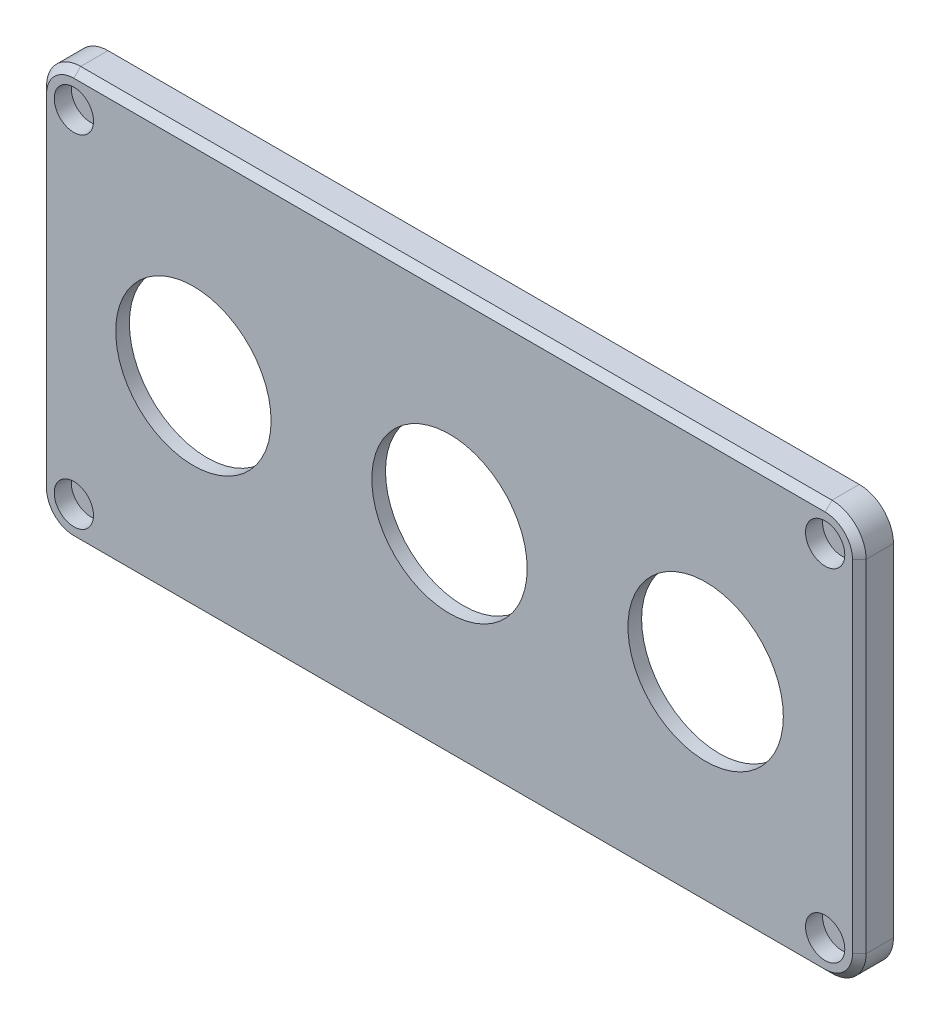
ISO-10303-21;
HEADER;
FILE_DESCRIPTION(('STEP AP214'),'2;1');
FILE_NAME('part.step','',(''),(''),'','','');
FILE_SCHEMA(('AUTOMOTIVE_DESIGN { 1 0 10303 214 1 1 1 1 }'));
ENDSEC;
DATA;
#1=APPLICATION_CONTEXT('core data for automotive mechanical design processes');
#2=APPLICATION_PROTOCOL_DEFINITION('international standard','automotive_design',2000,#1);
#3=PRODUCT_CONTEXT('',#1,'mechanical');
#4=PRODUCT('Part','Part','',(#3));
#5=PRODUCT_RELATED_PRODUCT_CATEGORY('part','',(#4));
#6=PRODUCT_DEFINITION_FORMATION('','',#4);
#7=PRODUCT_DEFINITION_CONTEXT('part definition',#1,'design');
#8=PRODUCT_DEFINITION('design','',#6,#7);
#9=PRODUCT_DEFINITION_SHAPE('','',#8);
#10=(LENGTH_UNIT() NAMED_UNIT(*) SI_UNIT(.MILLI.,.METRE.));
#11=(NAMED_UNIT(*) PLANE_ANGLE_UNIT() SI_UNIT($,.RADIAN.));
#12=(NAMED_UNIT(*) SI_UNIT($,.STERADIAN.) SOLID_ANGLE_UNIT());
#13=UNCERTAINTY_MEASURE_WITH_UNIT(LENGTH_MEASURE(1.E-05),#10,'distance_accuracy_value','');
#14=(GEOMETRIC_REPRESENTATION_CONTEXT(3) GLOBAL_UNCERTAINTY_ASSIGNED_CONTEXT((#13)) GLOBAL_UNIT_ASSIGNED_CONTEXT((#10,
#11,#12)) REPRESENTATION_CONTEXT('',''));
#15=CARTESIAN_POINT('',(0.,0.,0.));
#16=DIRECTION('',(0.,0.,1.));
#17=DIRECTION('',(1.,0.,0.));
#18=AXIS2_PLACEMENT_3D('',#15,#16,#17);
#19=CARTESIAN_POINT('',(-55.,25.,0.));
#20=DIRECTION('',(0.,0.,1.));
#21=DIRECTION('',(1.,0.,0.));
#22=AXIS2_PLACEMENT_3D('',#19,#20,#21);
#23=CYLINDRICAL_SURFACE('',#22,1.5);
#24=CARTESIAN_POINT('',(-55.,25.,0.));
#25=DIRECTION('',(0.,0.,1.));
#26=DIRECTION('',(1.,0.,0.));
#27=AXIS2_PLACEMENT_3D('',#24,#25,#26);
#28=CIRCLE('',#27,1.5);
#29=CARTESIAN_POINT('',(-53.5,25.,0.));
#30=VERTEX_POINT('',#29);
#31=EDGE_CURVE('E457',#30,#30,#28,.T.);
#32=ORIENTED_EDGE('',*,*,#31,.F.);
#33=EDGE_LOOP('',(#32));
#34=FACE_BOUND('',#33,.T.);
#35=CARTESIAN_POINT('',(-55.,25.,2.35));
#36=DIRECTION('',(0.,0.,1.));
#37=DIRECTION('',(1.,0.,0.));
#38=AXIS2_PLACEMENT_3D('',#35,#36,#37);
#39=CIRCLE('',#38,1.5);
#40=CARTESIAN_POINT('',(-53.5,25.,2.35));
#41=VERTEX_POINT('',#40);
#42=EDGE_CURVE('E11',#41,#41,#39,.F.);
#43=ORIENTED_EDGE('',*,*,#42,.F.);
#44=EDGE_LOOP('',(#43));
#45=FACE_BOUND('',#44,.T.);
#46=ADVANCED_FACE('F49',(#34,#45),#23,.F.);
#47=CARTESIAN_POINT('',(55.,25.,0.));
#48=DIRECTION('',(0.,0.,1.));
#49=DIRECTION('',(1.,0.,0.));
#50=AXIS2_PLACEMENT_3D('',#47,#48,#49);
#51=CYLINDRICAL_SURFACE('',#50,1.5);
#52=CARTESIAN_POINT('',(55.,25.,0.));
#53=DIRECTION('',(0.,0.,1.));
#54=DIRECTION('',(1.,0.,0.));
#55=AXIS2_PLACEMENT_3D('',#52,#53,#54);
#56=CIRCLE('',#55,1.5);
#57=CARTESIAN_POINT('',(56.5,25.,0.));
#58=VERTEX_POINT('',#57);
#59=EDGE_CURVE('E464',#58,#58,#56,.T.);
#60=ORIENTED_EDGE('',*,*,#59,.F.);
#61=EDGE_LOOP('',(#60));
#62=FACE_BOUND('',#61,.T.);
#63=CARTESIAN_POINT('',(55.,25.,2.35));
#64=DIRECTION('',(0.,0.,1.));
#65=DIRECTION('',(1.,0.,0.));
#66=AXIS2_PLACEMENT_3D('',#63,#64,#65);
#67=CIRCLE('',#66,1.5);
#68=CARTESIAN_POINT('',(56.5,25.,2.35));
#69=VERTEX_POINT('',#68);
#70=EDGE_CURVE('E59',#69,#69,#67,.F.);
#71=ORIENTED_EDGE('',*,*,#70,.F.);
#72=EDGE_LOOP('',(#71));
#73=FACE_BOUND('',#72,.T.);
#74=ADVANCED_FACE('F309',(#62,#73),#51,.F.);
#75=CARTESIAN_POINT('',(55.,-25.,0.));
#76=DIRECTION('',(0.,0.,1.));
#77=DIRECTION('',(1.,0.,0.));
#78=AXIS2_PLACEMENT_3D('',#75,#76,#77);
#79=CYLINDRICAL_SURFACE('',#78,1.5);
#80=CARTESIAN_POINT('',(55.,-25.,0.));
#81=DIRECTION('',(0.,0.,1.));
#82=DIRECTION('',(1.,0.,0.));
#83=AXIS2_PLACEMENT_3D('',#80,#81,#82);
#84=CIRCLE('',#83,1.5);
#85=CARTESIAN_POINT('',(56.5,-25.,0.));
#86=VERTEX_POINT('',#85);
#87=EDGE_CURVE('E469',#86,#86,#84,.T.);
#88=ORIENTED_EDGE('',*,*,#87,.F.);
#89=EDGE_LOOP('',(#88));
#90=FACE_BOUND('',#89,.T.);
#91=CARTESIAN_POINT('',(55.,-25.,2.35));
#92=DIRECTION('',(0.,0.,1.));
#93=DIRECTION('',(1.,0.,0.));
#94=AXIS2_PLACEMENT_3D('',#91,#92,#93);
#95=CIRCLE('',#94,1.5);
#96=CARTESIAN_POINT('',(56.5,-25.,2.35));
#97=VERTEX_POINT('',#96);
#98=EDGE_CURVE('E300',#97,#97,#95,.F.);
#99=ORIENTED_EDGE('',*,*,#98,.F.);
#100=EDGE_LOOP('',(#99));
#101=FACE_BOUND('',#100,.T.);
#102=ADVANCED_FACE('F311',(#90,#101),#79,.F.);
#103=CARTESIAN_POINT('',(-55.,-25.,0.));
#104=DIRECTION('',(0.,0.,1.));
#105=DIRECTION('',(1.,0.,0.));
#106=AXIS2_PLACEMENT_3D('',#103,#104,#105);
#107=CYLINDRICAL_SURFACE('',#106,1.5);
#108=CARTESIAN_POINT('',(-55.,-25.,0.));
#109=DIRECTION('',(0.,0.,1.));
#110=DIRECTION('',(1.,0.,0.));
#111=AXIS2_PLACEMENT_3D('',#108,#109,#110);
#112=CIRCLE('',#111,1.5);
#113=CARTESIAN_POINT('',(-53.5,-25.,0.));
#114=VERTEX_POINT('',#113);
#115=EDGE_CURVE('E465',#114,#114,#112,.T.);
#116=ORIENTED_EDGE('',*,*,#115,.F.);
#117=EDGE_LOOP('',(#116));
#118=FACE_BOUND('',#117,.T.);
#119=CARTESIAN_POINT('',(-55.,-25.,2.35));
#120=DIRECTION('',(0.,0.,1.));
#121=DIRECTION('',(1.,0.,0.));
#122=AXIS2_PLACEMENT_3D('',#119,#120,#121);
#123=CIRCLE('',#122,1.5);
#124=CARTESIAN_POINT('',(-53.5,-25.,2.35));
#125=VERTEX_POINT('',#124);
#126=EDGE_CURVE('E252',#125,#125,#123,.F.);
#127=ORIENTED_EDGE('',*,*,#126,.F.);
#128=EDGE_LOOP('',(#127));
#129=FACE_BOUND('',#128,.T.);
#130=ADVANCED_FACE('F318',(#118,#129),#107,.F.);
#131=CARTESIAN_POINT('',(0.,0.,0.));
#132=DIRECTION('',(0.,0.,1.));
#133=DIRECTION('',(1.,0.,0.));
#134=AXIS2_PLACEMENT_3D('',#131,#132,#133);
#135=CYLINDRICAL_SURFACE('',#134,11.375);
#136=CARTESIAN_POINT('',(0.,0.,5.));
#137=DIRECTION('',(0.,0.,1.));
#138=DIRECTION('',(1.,0.,0.));
#139=AXIS2_PLACEMENT_3D('',#136,#137,#138);
#140=CIRCLE('',#139,11.375);
#141=CARTESIAN_POINT('',(11.375,0.,5.));
#142=VERTEX_POINT('',#141);
#143=EDGE_CURVE('E444',#142,#142,#140,.T.);
#144=ORIENTED_EDGE('',*,*,#143,.T.);
#145=EDGE_LOOP('',(#144));
#146=FACE_BOUND('',#145,.T.);
#147=CARTESIAN_POINT('',(0.,0.,3.));
#148=DIRECTION('',(0.,0.,-1.));
#149=DIRECTION('',(-1.,0.,0.));
#150=AXIS2_PLACEMENT_3D('',#147,#148,#149);
#151=CIRCLE('',#150,11.375);
#152=CARTESIAN_POINT('',(-11.375,0.,3.));
#153=VERTEX_POINT('',#152);
#154=EDGE_CURVE('E257',#153,#153,#151,.F.);
#155=ORIENTED_EDGE('',*,*,#154,.F.);
#156=EDGE_LOOP('',(#155));
#157=FACE_BOUND('',#156,.T.);
#158=ADVANCED_FACE('F329',(#146,#157),#135,.F.);
#159=CARTESIAN_POINT('',(37.5,0.,0.));
#160=DIRECTION('',(0.,0.,1.));
#161=DIRECTION('',(1.,0.,0.));
#162=AXIS2_PLACEMENT_3D('',#159,#160,#161);
#163=CYLINDRICAL_SURFACE('',#162,11.375);
#164=CARTESIAN_POINT('',(37.5,0.,5.));
#165=DIRECTION('',(0.,0.,1.));
#166=DIRECTION('',(1.,0.,0.));
#167=AXIS2_PLACEMENT_3D('',#164,#165,#166);
#168=CIRCLE('',#167,11.375);
#169=CARTESIAN_POINT('',(48.875,0.,5.));
#170=VERTEX_POINT('',#169);
#171=EDGE_CURVE('E450',#170,#170,#168,.T.);
#172=ORIENTED_EDGE('',*,*,#171,.T.);
#173=EDGE_LOOP('',(#172));
#174=FACE_BOUND('',#173,.T.);
#175=CARTESIAN_POINT('',(37.5,0.,3.));
#176=DIRECTION('',(0.,0.,-1.));
#177=DIRECTION('',(-1.,0.,0.));
#178=AXIS2_PLACEMENT_3D('',#175,#176,#177);
#179=CIRCLE('',#178,11.375);
#180=CARTESIAN_POINT('',(26.125,0.,3.));
#181=VERTEX_POINT('',#180);
#182=EDGE_CURVE('E289',#181,#181,#179,.F.);
#183=ORIENTED_EDGE('',*,*,#182,.F.);
#184=EDGE_LOOP('',(#183));
#185=FACE_BOUND('',#184,.T.);
#186=ADVANCED_FACE('F332',(#174,#185),#163,.F.);
#187=CARTESIAN_POINT('',(-37.5,0.,0.));
#188=DIRECTION('',(0.,0.,1.));
#189=DIRECTION('',(1.,0.,0.));
#190=AXIS2_PLACEMENT_3D('',#187,#188,#189);
#191=CYLINDRICAL_SURFACE('',#190,11.375);
#192=CARTESIAN_POINT('',(-37.5,0.,5.));
#193=DIRECTION('',(0.,0.,1.));
#194=DIRECTION('',(1.,0.,0.));
#195=AXIS2_PLACEMENT_3D('',#192,#193,#194);
#196=CIRCLE('',#195,11.375);
#197=CARTESIAN_POINT('',(-26.125,0.,5.));
#198=VERTEX_POINT('',#197);
#199=EDGE_CURVE('E453',#198,#198,#196,.T.);
#200=ORIENTED_EDGE('',*,*,#199,.T.);
#201=EDGE_LOOP('',(#200));
#202=FACE_BOUND('',#201,.T.);
#203=CARTESIAN_POINT('',(-37.5,0.,3.));
#204=DIRECTION('',(0.,0.,-1.));
#205=DIRECTION('',(-1.,0.,0.));
#206=AXIS2_PLACEMENT_3D('',#203,#204,#205);
#207=CIRCLE('',#206,11.375);
#208=CARTESIAN_POINT('',(-48.875,0.,3.));
#209=VERTEX_POINT('',#208);
#210=EDGE_CURVE('E285',#209,#209,#207,.F.);
#211=ORIENTED_EDGE('',*,*,#210,.F.);
#212=EDGE_LOOP('',(#211));
#213=FACE_BOUND('',#212,.T.);
#214=ADVANCED_FACE('F335',(#202,#213),#191,.F.);
#215=CARTESIAN_POINT('',(60.,30.,5.));
#216=DIRECTION('',(-1.,0.,0.));
#217=DIRECTION('',(0.,-1.,0.));
#218=AXIS2_PLACEMENT_3D('',#215,#216,#217);
#219=PLANE('',#218);
#220=DIRECTION('',(0.,0.,-1.));
#221=VECTOR('',#220,1.);
#222=CARTESIAN_POINT('',(60.,25.,5.));
#223=LINE('',#222,#221);
#224=CARTESIAN_POINT('',(60.,25.,0.));
#225=VERTEX_POINT('',#224);
#226=CARTESIAN_POINT('',(60.,25.,4.));
#227=VERTEX_POINT('',#226);
#228=EDGE_CURVE('E193',#225,#227,#223,.F.);
#229=ORIENTED_EDGE('',*,*,#228,.T.);
#230=DIRECTION('',(0.,-1.,0.));
#231=VECTOR('',#230,1.);
#232=CARTESIAN_POINT('',(60.,-25.,4.));
#233=LINE('',#232,#231);
#234=CARTESIAN_POINT('',(60.,-25.,4.));
#235=VERTEX_POINT('',#234);
#236=EDGE_CURVE('E239',#227,#235,#233,.T.);
#237=ORIENTED_EDGE('',*,*,#236,.T.);
#238=DIRECTION('',(0.,0.,-1.));
#239=VECTOR('',#238,1.);
#240=CARTESIAN_POINT('',(60.,-25.,5.));
#241=LINE('',#240,#239);
#242=CARTESIAN_POINT('',(60.,-25.,0.));
#243=VERTEX_POINT('',#242);
#244=EDGE_CURVE('E197',#235,#243,#241,.T.);
#245=ORIENTED_EDGE('',*,*,#244,.T.);
#246=DIRECTION('',(0.,1.,0.));
#247=VECTOR('',#246,1.);
#248=CARTESIAN_POINT('',(60.,30.,0.));
#249=LINE('',#248,#247);
#250=EDGE_CURVE('E442',#243,#225,#249,.T.);
#251=ORIENTED_EDGE('',*,*,#250,.T.);
#252=EDGE_LOOP('',(#229,#237,#245,#251));
#253=FACE_BOUND('',#252,.T.);
#254=ADVANCED_FACE('F339',(#253),#219,.F.);
#255=CARTESIAN_POINT('',(-60.,30.,5.));
#256=DIRECTION('',(0.,-1.,0.));
#257=DIRECTION('',(0.,0.,-1.));
#258=AXIS2_PLACEMENT_3D('',#255,#256,#257);
#259=PLANE('',#258);
#260=DIRECTION('',(0.,0.,-1.));
#261=VECTOR('',#260,1.);
#262=CARTESIAN_POINT('',(-55.,30.,5.));
#263=LINE('',#262,#261);
#264=CARTESIAN_POINT('',(-55.,30.,0.));
#265=VERTEX_POINT('',#264);
#266=CARTESIAN_POINT('',(-55.,30.,4.));
#267=VERTEX_POINT('',#266);
#268=EDGE_CURVE('E200',#265,#267,#263,.F.);
#269=ORIENTED_EDGE('',*,*,#268,.T.);
#270=DIRECTION('',(1.,0.,0.));
#271=VECTOR('',#270,1.);
#272=CARTESIAN_POINT('',(55.,30.,4.));
#273=LINE('',#272,#271);
#274=CARTESIAN_POINT('',(55.,30.,4.));
#275=VERTEX_POINT('',#274);
#276=EDGE_CURVE('E73',#267,#275,#273,.T.);
#277=ORIENTED_EDGE('',*,*,#276,.T.);
#278=DIRECTION('',(0.,0.,-1.));
#279=VECTOR('',#278,1.);
#280=CARTESIAN_POINT('',(55.,30.,5.));
#281=LINE('',#280,#279);
#282=CARTESIAN_POINT('',(55.,30.,0.));
#283=VERTEX_POINT('',#282);
#284=EDGE_CURVE('E203',#275,#283,#281,.T.);
#285=ORIENTED_EDGE('',*,*,#284,.T.);
#286=DIRECTION('',(-1.,0.,0.));
#287=VECTOR('',#286,1.);
#288=CARTESIAN_POINT('',(-60.,30.,0.));
#289=LINE('',#288,#287);
#290=EDGE_CURVE('E178',#283,#265,#289,.T.);
#291=ORIENTED_EDGE('',*,*,#290,.T.);
#292=EDGE_LOOP('',(#269,#277,#285,#291));
#293=FACE_BOUND('',#292,.T.);
#294=ADVANCED_FACE('F356',(#293),#259,.F.);
#295=CARTESIAN_POINT('',(-60.,30.,5.));
#296=DIRECTION('',(1.,0.,0.));
#297=DIRECTION('',(0.,1.,0.));
#298=AXIS2_PLACEMENT_3D('',#295,#296,#297);
#299=PLANE('',#298);
#300=DIRECTION('',(0.,0.,-1.));
#301=VECTOR('',#300,1.);
#302=CARTESIAN_POINT('',(-60.,-25.,5.));
#303=LINE('',#302,#301);
#304=CARTESIAN_POINT('',(-60.,-25.,0.));
#305=VERTEX_POINT('',#304);
#306=CARTESIAN_POINT('',(-60.,-25.,4.));
#307=VERTEX_POINT('',#306);
#308=EDGE_CURVE('E161',#305,#307,#303,.F.);
#309=ORIENTED_EDGE('',*,*,#308,.T.);
#310=DIRECTION('',(0.,1.,0.));
#311=VECTOR('',#310,1.);
#312=CARTESIAN_POINT('',(-60.,25.,4.));
#313=LINE('',#312,#311);
#314=CARTESIAN_POINT('',(-60.,25.,4.));
#315=VERTEX_POINT('',#314);
#316=EDGE_CURVE('E242',#307,#315,#313,.T.);
#317=ORIENTED_EDGE('',*,*,#316,.T.);
#318=DIRECTION('',(0.,0.,-1.));
#319=VECTOR('',#318,1.);
#320=CARTESIAN_POINT('',(-60.,25.,5.));
#321=LINE('',#320,#319);
#322=CARTESIAN_POINT('',(-60.,25.,0.));
#323=VERTEX_POINT('',#322);
#324=EDGE_CURVE('E166',#315,#323,#321,.T.);
#325=ORIENTED_EDGE('',*,*,#324,.T.);
#326=DIRECTION('',(0.,-1.,0.));
#327=VECTOR('',#326,1.);
#328=CARTESIAN_POINT('',(-60.,30.,0.));
#329=LINE('',#328,#327);
#330=EDGE_CURVE('E173',#323,#305,#329,.T.);
#331=ORIENTED_EDGE('',*,*,#330,.T.);
#332=EDGE_LOOP('',(#309,#317,#325,#331));
#333=FACE_BOUND('',#332,.T.);
#334=ADVANCED_FACE('F353',(#333),#299,.F.);
#335=CARTESIAN_POINT('',(-60.,-30.,5.));
#336=DIRECTION('',(0.,1.,0.));
#337=DIRECTION('',(0.,0.,1.));
#338=AXIS2_PLACEMENT_3D('',#335,#336,#337);
#339=PLANE('',#338);
#340=DIRECTION('',(0.,0.,-1.));
#341=VECTOR('',#340,1.);
#342=CARTESIAN_POINT('',(55.,-30.,5.));
#343=LINE('',#342,#341);
#344=CARTESIAN_POINT('',(55.,-30.,0.));
#345=VERTEX_POINT('',#344);
#346=CARTESIAN_POINT('',(55.,-30.,4.));
#347=VERTEX_POINT('',#346);
#348=EDGE_CURVE('E155',#345,#347,#343,.F.);
#349=ORIENTED_EDGE('',*,*,#348,.T.);
#350=DIRECTION('',(-1.,0.,0.));
#351=VECTOR('',#350,1.);
#352=CARTESIAN_POINT('',(-55.,-30.,4.));
#353=LINE('',#352,#351);
#354=CARTESIAN_POINT('',(-55.,-30.,4.));
#355=VERTEX_POINT('',#354);
#356=EDGE_CURVE('E151',#347,#355,#353,.T.);
#357=ORIENTED_EDGE('',*,*,#356,.T.);
#358=DIRECTION('',(0.,0.,-1.));
#359=VECTOR('',#358,1.);
#360=CARTESIAN_POINT('',(-55.,-30.,5.));
#361=LINE('',#360,#359);
#362=CARTESIAN_POINT('',(-55.,-30.,0.));
#363=VERTEX_POINT('',#362);
#364=EDGE_CURVE('E143',#355,#363,#361,.T.);
#365=ORIENTED_EDGE('',*,*,#364,.T.);
#366=DIRECTION('',(1.,0.,0.));
#367=VECTOR('',#366,1.);
#368=CARTESIAN_POINT('',(-60.,-30.,0.));
#369=LINE('',#368,#367);
#370=EDGE_CURVE('E148',#363,#345,#369,.T.);
#371=ORIENTED_EDGE('',*,*,#370,.T.);
#372=EDGE_LOOP('',(#349,#357,#365,#371));
#373=FACE_BOUND('',#372,.T.);
#374=ADVANCED_FACE('F146',(#373),#339,.F.);
#375=CARTESIAN_POINT('',(0.,0.,5.));
#376=DIRECTION('',(0.,0.,1.));
#377=DIRECTION('',(1.,0.,0.));
#378=AXIS2_PLACEMENT_3D('',#375,#376,#377);
#379=PLANE('',#378);
#380=CARTESIAN_POINT('',(-55.,-25.,5.));
#381=DIRECTION('',(0.,0.,1.));
#382=DIRECTION('',(1.,0.,0.));
#383=AXIS2_PLACEMENT_3D('',#380,#381,#382);
#384=CIRCLE('',#383,4.00000000000001);
#385=CARTESIAN_POINT('',(-59.,-25.,5.));
#386=VERTEX_POINT('',#385);
#387=CARTESIAN_POINT('',(-55.,-29.,5.));
#388=VERTEX_POINT('',#387);
#389=EDGE_CURVE('E221',#386,#388,#384,.T.);
#390=ORIENTED_EDGE('',*,*,#389,.T.);
#391=DIRECTION('',(1.,0.,0.));
#392=VECTOR('',#391,1.);
#393=CARTESIAN_POINT('',(55.,-29.,5.));
#394=LINE('',#393,#392);
#395=CARTESIAN_POINT('',(55.,-29.,5.));
#396=VERTEX_POINT('',#395);
#397=EDGE_CURVE('E227',#388,#396,#394,.T.);
#398=ORIENTED_EDGE('',*,*,#397,.T.);
#399=CARTESIAN_POINT('',(55.,-25.,5.));
#400=DIRECTION('',(0.,0.,1.));
#401=DIRECTION('',(1.,0.,0.));
#402=AXIS2_PLACEMENT_3D('',#399,#400,#401);
#403=CIRCLE('',#402,4.00000000000001);
#404=CARTESIAN_POINT('',(59.,-25.,5.));
#405=VERTEX_POINT('',#404);
#406=EDGE_CURVE('E224',#396,#405,#403,.T.);
#407=ORIENTED_EDGE('',*,*,#406,.T.);
#408=DIRECTION('',(0.,1.,0.));
#409=VECTOR('',#408,1.);
#410=CARTESIAN_POINT('',(59.,25.,5.));
#411=LINE('',#410,#409);
#412=CARTESIAN_POINT('',(59.,25.,5.));
#413=VERTEX_POINT('',#412);
#414=EDGE_CURVE('E218',#405,#413,#411,.T.);
#415=ORIENTED_EDGE('',*,*,#414,.T.);
#416=CARTESIAN_POINT('',(55.,25.,5.));
#417=DIRECTION('',(0.,0.,1.));
#418=DIRECTION('',(1.,0.,0.));
#419=AXIS2_PLACEMENT_3D('',#416,#417,#418);
#420=CIRCLE('',#419,4.00000000000001);
#421=CARTESIAN_POINT('',(55.,29.,5.));
#422=VERTEX_POINT('',#421);
#423=EDGE_CURVE('E212',#413,#422,#420,.T.);
#424=ORIENTED_EDGE('',*,*,#423,.T.);
#425=DIRECTION('',(-1.,0.,0.));
#426=VECTOR('',#425,1.);
#427=CARTESIAN_POINT('',(-55.,29.,5.));
#428=LINE('',#427,#426);
#429=CARTESIAN_POINT('',(-55.,29.,5.));
#430=VERTEX_POINT('',#429);
#431=EDGE_CURVE('E206',#422,#430,#428,.T.);
#432=ORIENTED_EDGE('',*,*,#431,.T.);
#433=CARTESIAN_POINT('',(-55.,25.,5.));
#434=DIRECTION('',(0.,0.,1.));
#435=DIRECTION('',(1.,0.,0.));
#436=AXIS2_PLACEMENT_3D('',#433,#434,#435);
#437=CIRCLE('',#436,4.00000000000001);
#438=CARTESIAN_POINT('',(-59.,25.,5.));
#439=VERTEX_POINT('',#438);
#440=EDGE_CURVE('E209',#430,#439,#437,.T.);
#441=ORIENTED_EDGE('',*,*,#440,.T.);
#442=DIRECTION('',(0.,-1.,0.));
#443=VECTOR('',#442,1.);
#444=CARTESIAN_POINT('',(-59.,-25.,5.));
#445=LINE('',#444,#443);
#446=EDGE_CURVE('E215',#439,#386,#445,.T.);
#447=ORIENTED_EDGE('',*,*,#446,.T.);
#448=EDGE_LOOP('',(#390,#398,#407,#415,#424,#432,#441,#447));
#449=FACE_BOUND('',#448,.T.);
#450=CARTESIAN_POINT('',(-55.,-25.,5.));
#451=DIRECTION('',(0.,0.,1.));
#452=DIRECTION('',(1.,0.,0.));
#453=AXIS2_PLACEMENT_3D('',#450,#451,#452);
#454=CIRCLE('',#453,2.875);
#455=CARTESIAN_POINT('',(-52.125,-25.,5.));
#456=VERTEX_POINT('',#455);
#457=EDGE_CURVE('E488',#456,#456,#454,.T.);
#458=ORIENTED_EDGE('',*,*,#457,.F.);
#459=EDGE_LOOP('',(#458));
#460=FACE_BOUND('',#459,.T.);
#461=CARTESIAN_POINT('',(55.,-25.,5.));
#462=DIRECTION('',(0.,0.,1.));
#463=DIRECTION('',(1.,0.,0.));
#464=AXIS2_PLACEMENT_3D('',#461,#462,#463);
#465=CIRCLE('',#464,2.875);
#466=CARTESIAN_POINT('',(57.875,-25.,5.));
#467=VERTEX_POINT('',#466);
#468=EDGE_CURVE('E496',#467,#467,#465,.T.);
#469=ORIENTED_EDGE('',*,*,#468,.F.);
#470=EDGE_LOOP('',(#469));
#471=FACE_BOUND('',#470,.T.);
#472=CARTESIAN_POINT('',(55.,25.,5.));
#473=DIRECTION('',(0.,0.,1.));
#474=DIRECTION('',(1.,0.,0.));
#475=AXIS2_PLACEMENT_3D('',#472,#473,#474);
#476=CIRCLE('',#475,2.875);
#477=CARTESIAN_POINT('',(57.875,25.,5.));
#478=VERTEX_POINT('',#477);
#479=EDGE_CURVE('E481',#478,#478,#476,.T.);
#480=ORIENTED_EDGE('',*,*,#479,.F.);
#481=EDGE_LOOP('',(#480));
#482=FACE_BOUND('',#481,.T.);
#483=CARTESIAN_POINT('',(-55.,25.,5.));
#484=DIRECTION('',(0.,0.,1.));
#485=DIRECTION('',(1.,0.,0.));
#486=AXIS2_PLACEMENT_3D('',#483,#484,#485);
#487=CIRCLE('',#486,2.875);
#488=CARTESIAN_POINT('',(-52.125,25.,5.));
#489=VERTEX_POINT('',#488);
#490=EDGE_CURVE('E477',#489,#489,#487,.T.);
#491=ORIENTED_EDGE('',*,*,#490,.F.);
#492=EDGE_LOOP('',(#491));
#493=FACE_BOUND('',#492,.T.);
#494=ORIENTED_EDGE('',*,*,#199,.F.);
#495=EDGE_LOOP('',(#494));
#496=FACE_BOUND('',#495,.T.);
#497=ORIENTED_EDGE('',*,*,#171,.F.);
#498=EDGE_LOOP('',(#497));
#499=FACE_BOUND('',#498,.T.);
#500=ORIENTED_EDGE('',*,*,#143,.F.);
#501=EDGE_LOOP('',(#500));
#502=FACE_BOUND('',#501,.T.);
#503=ADVANCED_FACE('F344',(#449,#460,#471,#482,#493,#496,#499,#502),#379,.T.);
#504=CARTESIAN_POINT('',(0.,0.,0.));
#505=DIRECTION('',(0.,0.,1.));
#506=DIRECTION('',(1.,0.,0.));
#507=AXIS2_PLACEMENT_3D('',#504,#505,#506);
#508=PLANE('',#507);
#509=CARTESIAN_POINT('',(37.5,0.,0.));
#510=DIRECTION('',(0.,0.,-1.));
#511=DIRECTION('',(-1.,0.,0.));
#512=AXIS2_PLACEMENT_3D('',#509,#510,#511);
#513=CIRCLE('',#512,16.);
#514=CARTESIAN_POINT('',(21.5,0.,0.));
#515=VERTEX_POINT('',#514);
#516=EDGE_CURVE('E523',#515,#515,#513,.T.);
#517=ORIENTED_EDGE('',*,*,#516,.F.);
#518=EDGE_LOOP('',(#517));
#519=FACE_BOUND('',#518,.T.);
#520=CARTESIAN_POINT('',(0.,0.,0.));
#521=DIRECTION('',(0.,0.,-1.));
#522=DIRECTION('',(-1.,0.,0.));
#523=AXIS2_PLACEMENT_3D('',#520,#521,#522);
#524=CIRCLE('',#523,16.);
#525=CARTESIAN_POINT('',(-16.,0.,0.));
#526=VERTEX_POINT('',#525);
#527=EDGE_CURVE('E519',#526,#526,#524,.T.);
#528=ORIENTED_EDGE('',*,*,#527,.F.);
#529=EDGE_LOOP('',(#528));
#530=FACE_BOUND('',#529,.T.);
#531=CARTESIAN_POINT('',(-37.5,0.,0.));
#532=DIRECTION('',(0.,0.,-1.));
#533=DIRECTION('',(-1.,0.,0.));
#534=AXIS2_PLACEMENT_3D('',#531,#532,#533);
#535=CIRCLE('',#534,16.);
#536=CARTESIAN_POINT('',(-53.5,0.,0.));
#537=VERTEX_POINT('',#536);
#538=EDGE_CURVE('E511',#537,#537,#535,.T.);
#539=ORIENTED_EDGE('',*,*,#538,.F.);
#540=EDGE_LOOP('',(#539));
#541=FACE_BOUND('',#540,.T.);
#542=ORIENTED_EDGE('',*,*,#115,.T.);
#543=EDGE_LOOP('',(#542));
#544=FACE_BOUND('',#543,.T.);
#545=ORIENTED_EDGE('',*,*,#87,.T.);
#546=EDGE_LOOP('',(#545));
#547=FACE_BOUND('',#546,.T.);
#548=ORIENTED_EDGE('',*,*,#59,.T.);
#549=EDGE_LOOP('',(#548));
#550=FACE_BOUND('',#549,.T.);
#551=ORIENTED_EDGE('',*,*,#31,.T.);
#552=EDGE_LOOP('',(#551));
#553=FACE_BOUND('',#552,.T.);
#554=ORIENTED_EDGE('',*,*,#370,.F.);
#555=CARTESIAN_POINT('',(-55.,-25.,0.));
#556=DIRECTION('',(0.,0.,1.));
#557=DIRECTION('',(1.,0.,0.));
#558=AXIS2_PLACEMENT_3D('',#555,#556,#557);
#559=CIRCLE('',#558,5.);
#560=EDGE_CURVE('E158',#363,#305,#559,.F.);
#561=ORIENTED_EDGE('',*,*,#560,.T.);
#562=ORIENTED_EDGE('',*,*,#330,.F.);
#563=CARTESIAN_POINT('',(-55.,25.,0.));
#564=DIRECTION('',(0.,0.,1.));
#565=DIRECTION('',(1.,0.,0.));
#566=AXIS2_PLACEMENT_3D('',#563,#564,#565);
#567=CIRCLE('',#566,5.);
#568=EDGE_CURVE('E154',#323,#265,#567,.F.);
#569=ORIENTED_EDGE('',*,*,#568,.T.);
#570=ORIENTED_EDGE('',*,*,#290,.F.);
#571=CARTESIAN_POINT('',(55.,25.,0.));
#572=DIRECTION('',(0.,0.,1.));
#573=DIRECTION('',(1.,0.,0.));
#574=AXIS2_PLACEMENT_3D('',#571,#572,#573);
#575=CIRCLE('',#574,5.);
#576=EDGE_CURVE('E184',#283,#225,#575,.F.);
#577=ORIENTED_EDGE('',*,*,#576,.T.);
#578=ORIENTED_EDGE('',*,*,#250,.F.);
#579=CARTESIAN_POINT('',(55.,-25.,0.));
#580=DIRECTION('',(0.,0.,1.));
#581=DIRECTION('',(1.,0.,0.));
#582=AXIS2_PLACEMENT_3D('',#579,#580,#581);
#583=CIRCLE('',#582,5.);
#584=EDGE_CURVE('E167',#243,#345,#583,.F.);
#585=ORIENTED_EDGE('',*,*,#584,.T.);
#586=EDGE_LOOP('',(#554,#561,#562,#569,#570,#577,#578,#585));
#587=FACE_BOUND('',#586,.T.);
#588=ADVANCED_FACE('F169',(#519,#530,#541,#544,#547,#550,#553,#587),#508,.F.);
#589=CARTESIAN_POINT('',(-55.,-25.,5.));
#590=DIRECTION('',(0.,0.,-1.));
#591=DIRECTION('',(-1.,0.,0.));
#592=AXIS2_PLACEMENT_3D('',#589,#590,#591);
#593=CYLINDRICAL_SURFACE('',#592,5.);
#594=ORIENTED_EDGE('',*,*,#364,.F.);
#595=CARTESIAN_POINT('',(-55.,-25.,4.));
#596=DIRECTION('',(0.,0.,1.));
#597=DIRECTION('',(1.,0.,0.));
#598=AXIS2_PLACEMENT_3D('',#595,#596,#597);
#599=CIRCLE('',#598,5.);
#600=EDGE_CURVE('E236',#355,#307,#599,.F.);
#601=ORIENTED_EDGE('',*,*,#600,.T.);
#602=ORIENTED_EDGE('',*,*,#308,.F.);
#603=ORIENTED_EDGE('',*,*,#560,.F.);
#604=EDGE_LOOP('',(#594,#601,#602,#603));
#605=FACE_BOUND('',#604,.T.);
#606=ADVANCED_FACE('F159',(#605),#593,.T.);
#607=CARTESIAN_POINT('',(55.,-25.,5.));
#608=DIRECTION('',(0.,0.,-1.));
#609=DIRECTION('',(-1.,0.,0.));
#610=AXIS2_PLACEMENT_3D('',#607,#608,#609);
#611=CYLINDRICAL_SURFACE('',#610,5.);
#612=ORIENTED_EDGE('',*,*,#244,.F.);
#613=CARTESIAN_POINT('',(55.,-25.,4.));
#614=DIRECTION('',(0.,0.,1.));
#615=DIRECTION('',(1.,0.,0.));
#616=AXIS2_PLACEMENT_3D('',#613,#614,#615);
#617=CIRCLE('',#616,5.);
#618=EDGE_CURVE('E233',#235,#347,#617,.F.);
#619=ORIENTED_EDGE('',*,*,#618,.T.);
#620=ORIENTED_EDGE('',*,*,#348,.F.);
#621=ORIENTED_EDGE('',*,*,#584,.F.);
#622=EDGE_LOOP('',(#612,#619,#620,#621));
#623=FACE_BOUND('',#622,.T.);
#624=ADVANCED_FACE('F365',(#623),#611,.T.);
#625=CARTESIAN_POINT('',(55.,25.,5.));
#626=DIRECTION('',(0.,0.,-1.));
#627=DIRECTION('',(-1.,0.,0.));
#628=AXIS2_PLACEMENT_3D('',#625,#626,#627);
#629=CYLINDRICAL_SURFACE('',#628,5.);
#630=ORIENTED_EDGE('',*,*,#284,.F.);
#631=CARTESIAN_POINT('',(55.,25.,4.));
#632=DIRECTION('',(0.,0.,1.));
#633=DIRECTION('',(1.,0.,0.));
#634=AXIS2_PLACEMENT_3D('',#631,#632,#633);
#635=CIRCLE('',#634,5.);
#636=EDGE_CURVE('E245',#275,#227,#635,.F.);
#637=ORIENTED_EDGE('',*,*,#636,.T.);
#638=ORIENTED_EDGE('',*,*,#228,.F.);
#639=ORIENTED_EDGE('',*,*,#576,.F.);
#640=EDGE_LOOP('',(#630,#637,#638,#639));
#641=FACE_BOUND('',#640,.T.);
#642=ADVANCED_FACE('F368',(#641),#629,.T.);
#643=CARTESIAN_POINT('',(-55.,25.,5.));
#644=DIRECTION('',(0.,0.,-1.));
#645=DIRECTION('',(-1.,0.,0.));
#646=AXIS2_PLACEMENT_3D('',#643,#644,#645);
#647=CYLINDRICAL_SURFACE('',#646,5.);
#648=ORIENTED_EDGE('',*,*,#324,.F.);
#649=CARTESIAN_POINT('',(-55.,25.,4.));
#650=DIRECTION('',(0.,0.,1.));
#651=DIRECTION('',(1.,0.,0.));
#652=AXIS2_PLACEMENT_3D('',#649,#650,#651);
#653=CIRCLE('',#652,5.);
#654=EDGE_CURVE('E66',#315,#267,#653,.F.);
#655=ORIENTED_EDGE('',*,*,#654,.T.);
#656=ORIENTED_EDGE('',*,*,#268,.F.);
#657=ORIENTED_EDGE('',*,*,#568,.F.);
#658=EDGE_LOOP('',(#648,#655,#656,#657));
#659=FACE_BOUND('',#658,.T.);
#660=ADVANCED_FACE('F372',(#659),#647,.T.);
#661=CARTESIAN_POINT('',(-55.,-25.,2.5));
#662=DIRECTION('',(0.,0.,1.));
#663=DIRECTION('',(1.,0.,0.));
#664=AXIS2_PLACEMENT_3D('',#661,#662,#663);
#665=PLANE('',#664);
#666=CARTESIAN_POINT('',(-55.,-25.,2.5));
#667=DIRECTION('',(0.,0.,1.));
#668=DIRECTION('',(1.,0.,0.));
#669=AXIS2_PLACEMENT_3D('',#666,#667,#668);
#670=CIRCLE('',#669,2.875);
#671=CARTESIAN_POINT('',(-52.125,-25.,2.5));
#672=VERTEX_POINT('',#671);
#673=EDGE_CURVE('E284',#672,#672,#670,.T.);
#674=ORIENTED_EDGE('',*,*,#673,.T.);
#675=EDGE_LOOP('',(#674));
#676=FACE_BOUND('',#675,.T.);
#677=ADVANCED_FACE('F376',(#676),#665,.T.);
#678=CARTESIAN_POINT('',(-55.,-25.,2.5));
#679=DIRECTION('',(0.,0.,1.));
#680=DIRECTION('',(1.,0.,0.));
#681=AXIS2_PLACEMENT_3D('',#678,#679,#680);
#682=CYLINDRICAL_SURFACE('',#681,2.875);
#683=ORIENTED_EDGE('',*,*,#673,.F.);
#684=EDGE_LOOP('',(#683));
#685=FACE_BOUND('',#684,.T.);
#686=ORIENTED_EDGE('',*,*,#457,.T.);
#687=EDGE_LOOP('',(#686));
#688=FACE_BOUND('',#687,.T.);
#689=ADVANCED_FACE('F598',(#685,#688),#682,.F.);
#690=CARTESIAN_POINT('',(55.,-25.,2.5));
#691=DIRECTION('',(0.,0.,1.));
#692=DIRECTION('',(1.,0.,0.));
#693=AXIS2_PLACEMENT_3D('',#690,#691,#692);
#694=PLANE('',#693);
#695=CARTESIAN_POINT('',(55.,-25.,2.5));
#696=DIRECTION('',(0.,0.,1.));
#697=DIRECTION('',(1.,0.,0.));
#698=AXIS2_PLACEMENT_3D('',#695,#696,#697);
#699=CIRCLE('',#698,2.875);
#700=CARTESIAN_POINT('',(57.875,-25.,2.5));
#701=VERTEX_POINT('',#700);
#702=EDGE_CURVE('E492',#701,#701,#699,.T.);
#703=ORIENTED_EDGE('',*,*,#702,.T.);
#704=EDGE_LOOP('',(#703));
#705=FACE_BOUND('',#704,.T.);
#706=ADVANCED_FACE('F594',(#705),#694,.T.);
#707=CARTESIAN_POINT('',(55.,-25.,2.5));
#708=DIRECTION('',(0.,0.,1.));
#709=DIRECTION('',(1.,0.,0.));
#710=AXIS2_PLACEMENT_3D('',#707,#708,#709);
#711=CYLINDRICAL_SURFACE('',#710,2.875);
#712=ORIENTED_EDGE('',*,*,#702,.F.);
#713=EDGE_LOOP('',(#712));
#714=FACE_BOUND('',#713,.T.);
#715=ORIENTED_EDGE('',*,*,#468,.T.);
#716=EDGE_LOOP('',(#715));
#717=FACE_BOUND('',#716,.T.);
#718=ADVANCED_FACE('F590',(#714,#717),#711,.F.);
#719=CARTESIAN_POINT('',(55.,25.,2.5));
#720=DIRECTION('',(0.,0.,1.));
#721=DIRECTION('',(1.,0.,0.));
#722=AXIS2_PLACEMENT_3D('',#719,#720,#721);
#723=PLANE('',#722);
#724=CARTESIAN_POINT('',(55.,25.,2.5));
#725=DIRECTION('',(0.,0.,1.));
#726=DIRECTION('',(1.,0.,0.));
#727=AXIS2_PLACEMENT_3D('',#724,#725,#726);
#728=CIRCLE('',#727,2.875);
#729=CARTESIAN_POINT('',(57.875,25.,2.5));
#730=VERTEX_POINT('',#729);
#731=EDGE_CURVE('E500',#730,#730,#728,.T.);
#732=ORIENTED_EDGE('',*,*,#731,.T.);
#733=EDGE_LOOP('',(#732));
#734=FACE_BOUND('',#733,.T.);
#735=ADVANCED_FACE('F586',(#734),#723,.T.);
#736=CARTESIAN_POINT('',(55.,25.,2.5));
#737=DIRECTION('',(0.,0.,1.));
#738=DIRECTION('',(1.,0.,0.));
#739=AXIS2_PLACEMENT_3D('',#736,#737,#738);
#740=CYLINDRICAL_SURFACE('',#739,2.875);
#741=ORIENTED_EDGE('',*,*,#731,.F.);
#742=EDGE_LOOP('',(#741));
#743=FACE_BOUND('',#742,.T.);
#744=ORIENTED_EDGE('',*,*,#479,.T.);
#745=EDGE_LOOP('',(#744));
#746=FACE_BOUND('',#745,.T.);
#747=ADVANCED_FACE('F582',(#743,#746),#740,.F.);
#748=CARTESIAN_POINT('',(-55.,25.,2.5));
#749=DIRECTION('',(0.,0.,1.));
#750=DIRECTION('',(1.,0.,0.));
#751=AXIS2_PLACEMENT_3D('',#748,#749,#750);
#752=PLANE('',#751);
#753=CARTESIAN_POINT('',(-55.,25.,2.5));
#754=DIRECTION('',(0.,0.,1.));
#755=DIRECTION('',(1.,0.,0.));
#756=AXIS2_PLACEMENT_3D('',#753,#754,#755);
#757=CIRCLE('',#756,2.875);
#758=CARTESIAN_POINT('',(-52.125,25.,2.5));
#759=VERTEX_POINT('',#758);
#760=EDGE_CURVE('E470',#759,#759,#757,.T.);
#761=ORIENTED_EDGE('',*,*,#760,.T.);
#762=EDGE_LOOP('',(#761));
#763=FACE_BOUND('',#762,.T.);
#764=ADVANCED_FACE('F585',(#763),#752,.T.);
#765=CARTESIAN_POINT('',(-55.,25.,2.5));
#766=DIRECTION('',(0.,0.,1.));
#767=DIRECTION('',(1.,0.,0.));
#768=AXIS2_PLACEMENT_3D('',#765,#766,#767);
#769=CYLINDRICAL_SURFACE('',#768,2.875);
#770=ORIENTED_EDGE('',*,*,#760,.F.);
#771=EDGE_LOOP('',(#770));
#772=FACE_BOUND('',#771,.T.);
#773=ORIENTED_EDGE('',*,*,#490,.T.);
#774=EDGE_LOOP('',(#773));
#775=FACE_BOUND('',#774,.T.);
#776=ADVANCED_FACE('F325',(#772,#775),#769,.F.);
#777=CARTESIAN_POINT('',(0.,29.,5.));
#778=DIRECTION('',(0.,0.707106781186552,0.707106781186543));
#779=DIRECTION('',(1.,0.,0.));
#780=AXIS2_PLACEMENT_3D('',#777,#778,#779);
#781=PLANE('',#780);
#782=DIRECTION('',(0.,-0.707106781186543,0.707106781186552));
#783=VECTOR('',#782,1.);
#784=CARTESIAN_POINT('',(55.,30.,4.));
#785=LINE('',#784,#783);
#786=EDGE_CURVE('E276',#275,#422,#785,.T.);
#787=ORIENTED_EDGE('',*,*,#786,.F.);
#788=ORIENTED_EDGE('',*,*,#276,.F.);
#789=DIRECTION('',(0.,0.707106781186543,-0.707106781186552));
#790=VECTOR('',#789,1.);
#791=CARTESIAN_POINT('',(-55.,29.,5.));
#792=LINE('',#791,#790);
#793=EDGE_CURVE('E280',#430,#267,#792,.T.);
#794=ORIENTED_EDGE('',*,*,#793,.F.);
#795=ORIENTED_EDGE('',*,*,#431,.F.);
#796=EDGE_LOOP('',(#787,#788,#794,#795));
#797=FACE_BOUND('',#796,.T.);
#798=ADVANCED_FACE('F52',(#797),#781,.T.);
#799=CARTESIAN_POINT('',(-55.,25.,5.));
#800=DIRECTION('',(0.,0.,-1.));
#801=DIRECTION('',(-1.,0.,0.));
#802=AXIS2_PLACEMENT_3D('',#799,#800,#801);
#803=CONICAL_SURFACE('',#802,4.00000000000001,0.785398163397441);
#804=ORIENTED_EDGE('',*,*,#793,.T.);
#805=ORIENTED_EDGE('',*,*,#654,.F.);
#806=DIRECTION('',(-0.707106781186543,0.,-0.707106781186552));
#807=VECTOR('',#806,1.);
#808=CARTESIAN_POINT('',(-59.,25.,5.));
#809=LINE('',#808,#807);
#810=EDGE_CURVE('E272',#439,#315,#809,.T.);
#811=ORIENTED_EDGE('',*,*,#810,.F.);
#812=ORIENTED_EDGE('',*,*,#440,.F.);
#813=EDGE_LOOP('',(#804,#805,#811,#812));
#814=FACE_BOUND('',#813,.T.);
#815=ADVANCED_FACE('F419',(#814),#803,.T.);
#816=CARTESIAN_POINT('',(55.,25.,5.));
#817=DIRECTION('',(0.,0.,-1.));
#818=DIRECTION('',(-1.,0.,0.));
#819=AXIS2_PLACEMENT_3D('',#816,#817,#818);
#820=CONICAL_SURFACE('',#819,4.00000000000001,0.785398163397443);
#821=ORIENTED_EDGE('',*,*,#786,.T.);
#822=ORIENTED_EDGE('',*,*,#423,.F.);
#823=DIRECTION('',(-0.707106781186543,0.,0.707106781186552));
#824=VECTOR('',#823,1.);
#825=CARTESIAN_POINT('',(60.,25.,4.));
#826=LINE('',#825,#824);
#827=EDGE_CURVE('E268',#227,#413,#826,.T.);
#828=ORIENTED_EDGE('',*,*,#827,.F.);
#829=ORIENTED_EDGE('',*,*,#636,.F.);
#830=EDGE_LOOP('',(#821,#822,#828,#829));
#831=FACE_BOUND('',#830,.T.);
#832=ADVANCED_FACE('F413',(#831),#820,.T.);
#833=CARTESIAN_POINT('',(-59.,0.,5.));
#834=DIRECTION('',(-0.707106781186554,0.,0.707106781186541));
#835=DIRECTION('',(0.,1.,0.));
#836=AXIS2_PLACEMENT_3D('',#833,#834,#835);
#837=PLANE('',#836);
#838=ORIENTED_EDGE('',*,*,#810,.T.);
#839=ORIENTED_EDGE('',*,*,#316,.F.);
#840=DIRECTION('',(-0.70710678118654,0.,-0.707106781186555));
#841=VECTOR('',#840,1.);
#842=CARTESIAN_POINT('',(-59.,-25.,5.));
#843=LINE('',#842,#841);
#844=EDGE_CURVE('E264',#386,#307,#843,.T.);
#845=ORIENTED_EDGE('',*,*,#844,.F.);
#846=ORIENTED_EDGE('',*,*,#446,.F.);
#847=EDGE_LOOP('',(#838,#839,#845,#846));
#848=FACE_BOUND('',#847,.T.);
#849=ADVANCED_FACE('F406',(#848),#837,.T.);
#850=CARTESIAN_POINT('',(59.,0.,5.));
#851=DIRECTION('',(0.707106781186551,0.,0.707106781186544));
#852=DIRECTION('',(0.,-1.,0.));
#853=AXIS2_PLACEMENT_3D('',#850,#851,#852);
#854=PLANE('',#853);
#855=ORIENTED_EDGE('',*,*,#827,.T.);
#856=ORIENTED_EDGE('',*,*,#414,.F.);
#857=DIRECTION('',(-0.707106781186543,0.,0.707106781186552));
#858=VECTOR('',#857,1.);
#859=CARTESIAN_POINT('',(60.,-25.,4.));
#860=LINE('',#859,#858);
#861=EDGE_CURVE('E260',#235,#405,#860,.T.);
#862=ORIENTED_EDGE('',*,*,#861,.F.);
#863=ORIENTED_EDGE('',*,*,#236,.F.);
#864=EDGE_LOOP('',(#855,#856,#862,#863));
#865=FACE_BOUND('',#864,.T.);
#866=ADVANCED_FACE('F399',(#865),#854,.T.);
#867=CARTESIAN_POINT('',(-55.,-25.,5.));
#868=DIRECTION('',(0.,0.,-1.));
#869=DIRECTION('',(-1.,0.,0.));
#870=AXIS2_PLACEMENT_3D('',#867,#868,#869);
#871=CONICAL_SURFACE('',#870,4.00000000000001,0.785398163397443);
#872=ORIENTED_EDGE('',*,*,#844,.T.);
#873=ORIENTED_EDGE('',*,*,#600,.F.);
#874=DIRECTION('',(0.,-0.707106781186544,-0.707106781186551));
#875=VECTOR('',#874,1.);
#876=CARTESIAN_POINT('',(-55.,-29.,5.));
#877=LINE('',#876,#875);
#878=EDGE_CURVE('E256',#388,#355,#877,.T.);
#879=ORIENTED_EDGE('',*,*,#878,.F.);
#880=ORIENTED_EDGE('',*,*,#389,.F.);
#881=EDGE_LOOP('',(#872,#873,#879,#880));
#882=FACE_BOUND('',#881,.T.);
#883=ADVANCED_FACE('F392',(#882),#871,.T.);
#884=CARTESIAN_POINT('',(55.,-25.,5.));
#885=DIRECTION('',(0.,0.,-1.));
#886=DIRECTION('',(-1.,0.,0.));
#887=AXIS2_PLACEMENT_3D('',#884,#885,#886);
#888=CONICAL_SURFACE('',#887,4.00000000000001,0.785398163397441);
#889=ORIENTED_EDGE('',*,*,#861,.T.);
#890=ORIENTED_EDGE('',*,*,#406,.F.);
#891=DIRECTION('',(0.,0.707106781186544,0.707106781186551));
#892=VECTOR('',#891,1.);
#893=CARTESIAN_POINT('',(55.,-30.,4.));
#894=LINE('',#893,#892);
#895=EDGE_CURVE('E253',#347,#396,#894,.T.);
#896=ORIENTED_EDGE('',*,*,#895,.F.);
#897=ORIENTED_EDGE('',*,*,#618,.F.);
#898=EDGE_LOOP('',(#889,#890,#896,#897));
#899=FACE_BOUND('',#898,.T.);
#900=ADVANCED_FACE('F385',(#899),#888,.T.);
#901=CARTESIAN_POINT('',(0.,-29.,5.));
#902=DIRECTION('',(0.,-0.707106781186552,0.707106781186543));
#903=DIRECTION('',(-1.,0.,0.));
#904=AXIS2_PLACEMENT_3D('',#901,#902,#903);
#905=PLANE('',#904);
#906=ORIENTED_EDGE('',*,*,#878,.T.);
#907=ORIENTED_EDGE('',*,*,#356,.F.);
#908=ORIENTED_EDGE('',*,*,#895,.T.);
#909=ORIENTED_EDGE('',*,*,#397,.F.);
#910=EDGE_LOOP('',(#906,#907,#908,#909));
#911=FACE_BOUND('',#910,.T.);
#912=ADVANCED_FACE('F378',(#911),#905,.T.);
#913=CARTESIAN_POINT('',(-37.5,0.,3.));
#914=DIRECTION('',(0.,0.,-1.));
#915=DIRECTION('',(-1.,0.,0.));
#916=AXIS2_PLACEMENT_3D('',#913,#914,#915);
#917=PLANE('',#916);
#918=CARTESIAN_POINT('',(-37.5,0.,3.));
#919=DIRECTION('',(0.,0.,-1.));
#920=DIRECTION('',(-1.,0.,0.));
#921=AXIS2_PLACEMENT_3D('',#918,#919,#920);
#922=CIRCLE('',#921,16.);
#923=CARTESIAN_POINT('',(-53.5,0.,3.));
#924=VERTEX_POINT('',#923);
#925=EDGE_CURVE('E507',#924,#924,#922,.T.);
#926=ORIENTED_EDGE('',*,*,#925,.T.);
#927=EDGE_LOOP('',(#926));
#928=FACE_BOUND('',#927,.T.);
#929=ORIENTED_EDGE('',*,*,#210,.T.);
#930=EDGE_LOOP('',(#929));
#931=FACE_BOUND('',#930,.T.);
#932=ADVANCED_FACE('F384',(#928,#931),#917,.T.);
#933=CARTESIAN_POINT('',(-37.5,0.,3.));
#934=DIRECTION('',(0.,0.,-1.));
#935=DIRECTION('',(-1.,0.,0.));
#936=AXIS2_PLACEMENT_3D('',#933,#934,#935);
#937=CYLINDRICAL_SURFACE('',#936,16.);
#938=ORIENTED_EDGE('',*,*,#925,.F.);
#939=EDGE_LOOP('',(#938));
#940=FACE_BOUND('',#939,.T.);
#941=ORIENTED_EDGE('',*,*,#538,.T.);
#942=EDGE_LOOP('',(#941));
#943=FACE_BOUND('',#942,.T.);
#944=ADVANCED_FACE('F567',(#940,#943),#937,.F.);
#945=CARTESIAN_POINT('',(37.5,0.,3.));
#946=DIRECTION('',(0.,0.,-1.));
#947=DIRECTION('',(-1.,0.,0.));
#948=AXIS2_PLACEMENT_3D('',#945,#946,#947);
#949=PLANE('',#948);
#950=CARTESIAN_POINT('',(37.5,0.,3.));
#951=DIRECTION('',(0.,0.,-1.));
#952=DIRECTION('',(-1.,0.,0.));
#953=AXIS2_PLACEMENT_3D('',#950,#951,#952);
#954=CIRCLE('',#953,16.);
#955=CARTESIAN_POINT('',(21.5,0.,3.));
#956=VERTEX_POINT('',#955);
#957=EDGE_CURVE('E290',#956,#956,#954,.T.);
#958=ORIENTED_EDGE('',*,*,#957,.T.);
#959=EDGE_LOOP('',(#958));
#960=FACE_BOUND('',#959,.T.);
#961=ORIENTED_EDGE('',*,*,#182,.T.);
#962=EDGE_LOOP('',(#961));
#963=FACE_BOUND('',#962,.T.);
#964=ADVANCED_FACE('F531',(#960,#963),#949,.T.);
#965=CARTESIAN_POINT('',(37.5,0.,3.));
#966=DIRECTION('',(0.,0.,-1.));
#967=DIRECTION('',(-1.,0.,0.));
#968=AXIS2_PLACEMENT_3D('',#965,#966,#967);
#969=CYLINDRICAL_SURFACE('',#968,16.);
#970=ORIENTED_EDGE('',*,*,#957,.F.);
#971=EDGE_LOOP('',(#970));
#972=FACE_BOUND('',#971,.T.);
#973=ORIENTED_EDGE('',*,*,#516,.T.);
#974=EDGE_LOOP('',(#973));
#975=FACE_BOUND('',#974,.T.);
#976=ADVANCED_FACE('F534',(#972,#975),#969,.F.);
#977=CARTESIAN_POINT('',(0.,0.,3.));
#978=DIRECTION('',(0.,0.,-1.));
#979=DIRECTION('',(-1.,0.,0.));
#980=AXIS2_PLACEMENT_3D('',#977,#978,#979);
#981=PLANE('',#980);
#982=CARTESIAN_POINT('',(0.,0.,3.));
#983=DIRECTION('',(0.,0.,-1.));
#984=DIRECTION('',(-1.,0.,0.));
#985=AXIS2_PLACEMENT_3D('',#982,#983,#984);
#986=CIRCLE('',#985,16.);
#987=CARTESIAN_POINT('',(-16.,0.,3.));
#988=VERTEX_POINT('',#987);
#989=EDGE_CURVE('E515',#988,#988,#986,.T.);
#990=ORIENTED_EDGE('',*,*,#989,.T.);
#991=EDGE_LOOP('',(#990));
#992=FACE_BOUND('',#991,.T.);
#993=ORIENTED_EDGE('',*,*,#154,.T.);
#994=EDGE_LOOP('',(#993));
#995=FACE_BOUND('',#994,.T.);
#996=ADVANCED_FACE('F537',(#992,#995),#981,.T.);
#997=CARTESIAN_POINT('',(0.,0.,3.));
#998=DIRECTION('',(0.,0.,-1.));
#999=DIRECTION('',(-1.,0.,0.));
#1000=AXIS2_PLACEMENT_3D('',#997,#998,#999);
#1001=CYLINDRICAL_SURFACE('',#1000,16.);
#1002=ORIENTED_EDGE('',*,*,#989,.F.);
#1003=EDGE_LOOP('',(#1002));
#1004=FACE_BOUND('',#1003,.T.);
#1005=ORIENTED_EDGE('',*,*,#527,.T.);
#1006=EDGE_LOOP('',(#1005));
#1007=FACE_BOUND('',#1006,.T.);
#1008=ADVANCED_FACE('F569',(#1004,#1007),#1001,.F.);
#1009=CARTESIAN_POINT('',(-55.,-25.,2.35));
#1010=DIRECTION('',(0.,0.,1.));
#1011=DIRECTION('',(1.,0.,0.));
#1012=AXIS2_PLACEMENT_3D('',#1009,#1010,#1011);
#1013=PLANE('',#1012);
#1014=ORIENTED_EDGE('',*,*,#126,.T.);
#1015=EDGE_LOOP('',(#1014));
#1016=FACE_BOUND('',#1015,.T.);
#1017=ADVANCED_FACE('F564',(#1016),#1013,.F.);
#1018=CARTESIAN_POINT('',(55.,-25.,2.35));
#1019=DIRECTION('',(0.,0.,1.));
#1020=DIRECTION('',(1.,0.,0.));
#1021=AXIS2_PLACEMENT_3D('',#1018,#1019,#1020);
#1022=PLANE('',#1021);
#1023=ORIENTED_EDGE('',*,*,#98,.T.);
#1024=EDGE_LOOP('',(#1023));
#1025=FACE_BOUND('',#1024,.T.);
#1026=ADVANCED_FACE('F560',(#1025),#1022,.F.);
#1027=CARTESIAN_POINT('',(55.,25.,2.35));
#1028=DIRECTION('',(0.,0.,1.));
#1029=DIRECTION('',(1.,0.,0.));
#1030=AXIS2_PLACEMENT_3D('',#1027,#1028,#1029);
#1031=PLANE('',#1030);
#1032=ORIENTED_EDGE('',*,*,#70,.T.);
#1033=EDGE_LOOP('',(#1032));
#1034=FACE_BOUND('',#1033,.T.);
#1035=ADVANCED_FACE('F307',(#1034),#1031,.F.);
#1036=CARTESIAN_POINT('',(-55.,25.,2.35));
#1037=DIRECTION('',(0.,0.,1.));
#1038=DIRECTION('',(1.,0.,0.));
#1039=AXIS2_PLACEMENT_3D('',#1036,#1037,#1038);
#1040=PLANE('',#1039);
#1041=ORIENTED_EDGE('',*,*,#42,.T.);
#1042=EDGE_LOOP('',(#1041));
#1043=FACE_BOUND('',#1042,.T.);
#1044=ADVANCED_FACE('F554',(#1043),#1040,.F.);
#1045=CLOSED_SHELL('',(#46,#74,#102,#130,#158,#186,#214,#254,#294,#334,#374,#503,#588,#606,#624,
#642,#660,#677,#689,#706,#718,#735,#747,#764,#776,#798,#815,#832,#849,#866,#883,#900,#912,#932,
#944,#964,#976,#996,#1008,#1017,#1026,#1035,#1044));
#1046=MANIFOLD_SOLID_BREP('B2',#1045);
#1047=ADVANCED_BREP_SHAPE_REPRESENTATION('',(#18,#1046),#14);
#1048=SHAPE_DEFINITION_REPRESENTATION(#9,#1047);
ENDSEC;
END-ISO-10303-21;
